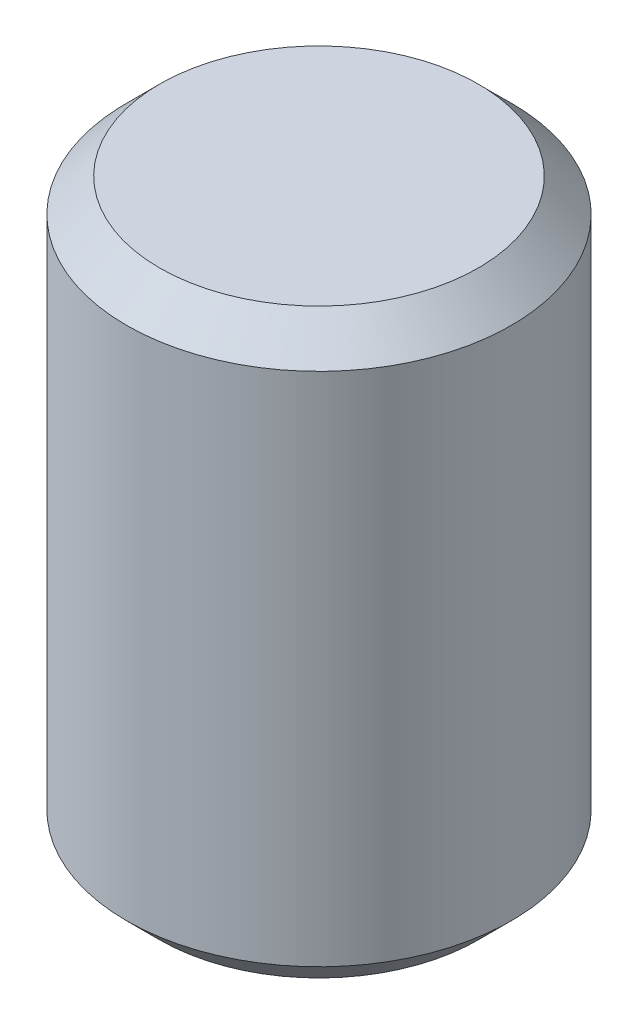
ISO-10303-21;
HEADER;
FILE_DESCRIPTION(('STEP AP214'),'2;1');
FILE_NAME('part.step','',(''),(''),'','','');
FILE_SCHEMA(('AUTOMOTIVE_DESIGN { 1 0 10303 214 1 1 1 1 }'));
ENDSEC;
DATA;
#1=APPLICATION_CONTEXT('core data for automotive mechanical design processes');
#2=APPLICATION_PROTOCOL_DEFINITION('international standard','automotive_design',2000,#1);
#3=PRODUCT_CONTEXT('',#1,'mechanical');
#4=PRODUCT('Part','Part','',(#3));
#5=PRODUCT_RELATED_PRODUCT_CATEGORY('part','',(#4));
#6=PRODUCT_DEFINITION_FORMATION('','',#4);
#7=PRODUCT_DEFINITION_CONTEXT('part definition',#1,'design');
#8=PRODUCT_DEFINITION('design','',#6,#7);
#9=PRODUCT_DEFINITION_SHAPE('','',#8);
#10=(LENGTH_UNIT() NAMED_UNIT(*) SI_UNIT(.MILLI.,.METRE.));
#11=(NAMED_UNIT(*) PLANE_ANGLE_UNIT() SI_UNIT($,.RADIAN.));
#12=(NAMED_UNIT(*) SI_UNIT($,.STERADIAN.) SOLID_ANGLE_UNIT());
#13=UNCERTAINTY_MEASURE_WITH_UNIT(LENGTH_MEASURE(1.E-05),#10,'distance_accuracy_value','');
#14=(GEOMETRIC_REPRESENTATION_CONTEXT(3) GLOBAL_UNCERTAINTY_ASSIGNED_CONTEXT((#13)) GLOBAL_UNIT_ASSIGNED_CONTEXT((#10,
#11,#12)) REPRESENTATION_CONTEXT('',''));
#15=CARTESIAN_POINT('',(0.,0.,0.));
#16=DIRECTION('',(0.,0.,1.));
#17=DIRECTION('',(1.,0.,0.));
#18=AXIS2_PLACEMENT_3D('',#15,#16,#17);
#19=CARTESIAN_POINT('',(0.,3.57124,0.));
#20=DIRECTION('',(0.,-1.,0.));
#21=DIRECTION('',(0.,0.,-1.));
#22=AXIS2_PLACEMENT_3D('',#19,#20,#21);
#23=CYLINDRICAL_SURFACE('',#22,1.1811);
#24=CARTESIAN_POINT('',(0.,0.2032,0.));
#25=DIRECTION('',(0.,1.,0.));
#26=DIRECTION('',(0.,0.,1.));
#27=AXIS2_PLACEMENT_3D('',#24,#25,#26);
#28=CIRCLE('',#27,1.1811);
#29=CARTESIAN_POINT('',(0.,0.2032,1.1811));
#30=VERTEX_POINT('',#29);
#31=EDGE_CURVE('E59',#30,#30,#28,.T.);
#32=ORIENTED_EDGE('',*,*,#31,.T.);
#33=EDGE_LOOP('',(#32));
#34=FACE_BOUND('',#33,.T.);
#35=CARTESIAN_POINT('',(0.,3.36804,0.));
#36=DIRECTION('',(0.,1.,0.));
#37=DIRECTION('',(0.,0.,1.));
#38=AXIS2_PLACEMENT_3D('',#35,#36,#37);
#39=CIRCLE('',#38,1.1811);
#40=CARTESIAN_POINT('',(0.,3.36804,1.1811));
#41=VERTEX_POINT('',#40);
#42=EDGE_CURVE('E64',#41,#41,#39,.F.);
#43=ORIENTED_EDGE('',*,*,#42,.T.);
#44=EDGE_LOOP('',(#43));
#45=FACE_BOUND('',#44,.T.);
#46=ADVANCED_FACE('F45',(#34,#45),#23,.T.);
#47=CARTESIAN_POINT('',(0.,3.57124,0.));
#48=DIRECTION('',(0.,1.,0.));
#49=DIRECTION('',(0.,0.,1.));
#50=AXIS2_PLACEMENT_3D('',#47,#48,#49);
#51=PLANE('',#50);
#52=CARTESIAN_POINT('',(0.,3.57124,0.));
#53=DIRECTION('',(0.,1.,0.));
#54=DIRECTION('',(0.,0.,1.));
#55=AXIS2_PLACEMENT_3D('',#52,#53,#54);
#56=CIRCLE('',#55,0.9779);
#57=CARTESIAN_POINT('',(0.,3.57124,0.9779));
#58=VERTEX_POINT('',#57);
#59=EDGE_CURVE('E12',#58,#58,#56,.T.);
#60=ORIENTED_EDGE('',*,*,#59,.T.);
#61=EDGE_LOOP('',(#60));
#62=FACE_BOUND('',#61,.T.);
#63=ADVANCED_FACE('F81',(#62),#51,.T.);
#64=CARTESIAN_POINT('',(0.,0.,0.));
#65=DIRECTION('',(0.,1.,0.));
#66=DIRECTION('',(0.,0.,1.));
#67=AXIS2_PLACEMENT_3D('',#64,#65,#66);
#68=PLANE('',#67);
#69=CARTESIAN_POINT('',(0.,0.,0.));
#70=DIRECTION('',(0.,1.,0.));
#71=DIRECTION('',(0.,0.,1.));
#72=AXIS2_PLACEMENT_3D('',#69,#70,#71);
#73=CIRCLE('',#72,0.9779);
#74=CARTESIAN_POINT('',(0.,0.,0.9779));
#75=VERTEX_POINT('',#74);
#76=EDGE_CURVE('E54',#75,#75,#73,.F.);
#77=ORIENTED_EDGE('',*,*,#76,.T.);
#78=EDGE_LOOP('',(#77));
#79=FACE_BOUND('',#78,.T.);
#80=ADVANCED_FACE('F78',(#79),#68,.F.);
#81=CARTESIAN_POINT('',(0.,0.2032,0.));
#82=DIRECTION('',(0.,1.,0.));
#83=DIRECTION('',(0.,0.,1.));
#84=AXIS2_PLACEMENT_3D('',#81,#82,#83);
#85=CONICAL_SURFACE('',#84,1.1811,0.785398163397448);
#86=ORIENTED_EDGE('',*,*,#76,.F.);
#87=EDGE_LOOP('',(#86));
#88=FACE_BOUND('',#87,.T.);
#89=ORIENTED_EDGE('',*,*,#31,.F.);
#90=EDGE_LOOP('',(#89));
#91=FACE_BOUND('',#90,.T.);
#92=ADVANCED_FACE('F74',(#88,#91),#85,.T.);
#93=CARTESIAN_POINT('',(0.,3.57124,0.));
#94=DIRECTION('',(0.,-1.,0.));
#95=DIRECTION('',(0.,0.,-1.));
#96=AXIS2_PLACEMENT_3D('',#93,#94,#95);
#97=CONICAL_SURFACE('',#96,0.9779,0.785398163397448);
#98=ORIENTED_EDGE('',*,*,#42,.F.);
#99=EDGE_LOOP('',(#98));
#100=FACE_BOUND('',#99,.T.);
#101=ORIENTED_EDGE('',*,*,#59,.F.);
#102=EDGE_LOOP('',(#101));
#103=FACE_BOUND('',#102,.T.);
#104=ADVANCED_FACE('F48',(#100,#103),#97,.T.);
#105=CLOSED_SHELL('',(#46,#63,#80,#92,#104));
#106=MANIFOLD_SOLID_BREP('B2',#105);
#107=ADVANCED_BREP_SHAPE_REPRESENTATION('',(#18,#106),#14);
#108=SHAPE_DEFINITION_REPRESENTATION(#9,#107);
ENDSEC;
END-ISO-10303-21;
